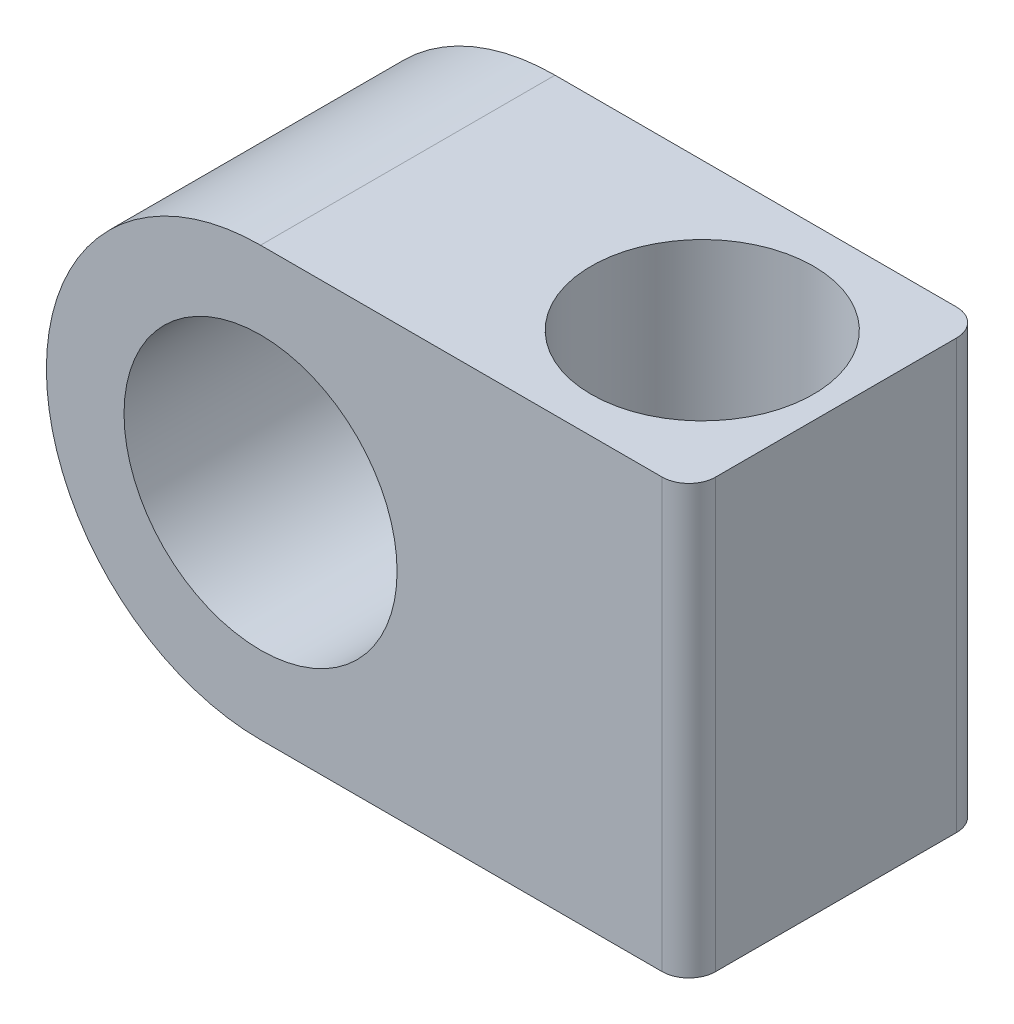
ISO-10303-21;
HEADER;
FILE_DESCRIPTION(('STEP AP214'),'2;1');
FILE_NAME('part.step','',(''),(''),'','','');
FILE_SCHEMA(('AUTOMOTIVE_DESIGN { 1 0 10303 214 1 1 1 1 }'));
ENDSEC;
DATA;
#1=APPLICATION_CONTEXT('core data for automotive mechanical design processes');
#2=APPLICATION_PROTOCOL_DEFINITION('international standard','automotive_design',2000,#1);
#3=PRODUCT_CONTEXT('',#1,'mechanical');
#4=PRODUCT('Part','Part','',(#3));
#5=PRODUCT_RELATED_PRODUCT_CATEGORY('part','',(#4));
#6=PRODUCT_DEFINITION_FORMATION('','',#4);
#7=PRODUCT_DEFINITION_CONTEXT('part definition',#1,'design');
#8=PRODUCT_DEFINITION('design','',#6,#7);
#9=PRODUCT_DEFINITION_SHAPE('','',#8);
#10=(LENGTH_UNIT() NAMED_UNIT(*) SI_UNIT(.MILLI.,.METRE.));
#11=(NAMED_UNIT(*) PLANE_ANGLE_UNIT() SI_UNIT($,.RADIAN.));
#12=(NAMED_UNIT(*) SI_UNIT($,.STERADIAN.) SOLID_ANGLE_UNIT());
#13=UNCERTAINTY_MEASURE_WITH_UNIT(LENGTH_MEASURE(1.E-05),#10,'distance_accuracy_value','');
#14=(GEOMETRIC_REPRESENTATION_CONTEXT(3) GLOBAL_UNCERTAINTY_ASSIGNED_CONTEXT((#13)) GLOBAL_UNIT_ASSIGNED_CONTEXT((#10,
#11,#12)) REPRESENTATION_CONTEXT('',''));
#15=CARTESIAN_POINT('',(0.,0.,0.));
#16=DIRECTION('',(0.,0.,1.));
#17=DIRECTION('',(1.,0.,0.));
#18=AXIS2_PLACEMENT_3D('',#15,#16,#17);
#19=CARTESIAN_POINT('',(15.,0.,10.));
#20=DIRECTION('',(0.,-1.,0.));
#21=DIRECTION('',(0.,0.,-1.));
#22=AXIS2_PLACEMENT_3D('',#19,#20,#21);
#23=CYLINDRICAL_SURFACE('',#22,1.);
#24=DIRECTION('',(0.,-1.,0.));
#25=VECTOR('',#24,1.);
#26=CARTESIAN_POINT('',(16.,0.,10.));
#27=LINE('',#26,#25);
#28=CARTESIAN_POINT('',(16.,8.,10.));
#29=VERTEX_POINT('',#28);
#30=CARTESIAN_POINT('',(16.,-8.,10.));
#31=VERTEX_POINT('',#30);
#32=EDGE_CURVE('E160',#29,#31,#27,.T.);
#33=ORIENTED_EDGE('',*,*,#32,.F.);
#34=CARTESIAN_POINT('',(15.,8.,10.));
#35=DIRECTION('',(0.,-1.,0.));
#36=DIRECTION('',(0.,0.,-1.));
#37=AXIS2_PLACEMENT_3D('',#34,#35,#36);
#38=CIRCLE('',#37,1.);
#39=CARTESIAN_POINT('',(15.,8.,11.));
#40=VERTEX_POINT('',#39);
#41=EDGE_CURVE('E53',#40,#29,#38,.F.);
#42=ORIENTED_EDGE('',*,*,#41,.F.);
#43=DIRECTION('',(0.,-1.,0.));
#44=VECTOR('',#43,1.);
#45=CARTESIAN_POINT('',(15.,0.,11.));
#46=LINE('',#45,#44);
#47=CARTESIAN_POINT('',(15.,-8.,11.));
#48=VERTEX_POINT('',#47);
#49=EDGE_CURVE('E100',#48,#40,#46,.F.);
#50=ORIENTED_EDGE('',*,*,#49,.F.);
#51=CARTESIAN_POINT('',(15.,-8.,10.));
#52=DIRECTION('',(0.,1.,0.));
#53=DIRECTION('',(0.,0.,1.));
#54=AXIS2_PLACEMENT_3D('',#51,#52,#53);
#55=CIRCLE('',#54,1.);
#56=EDGE_CURVE('E11',#31,#48,#55,.F.);
#57=ORIENTED_EDGE('',*,*,#56,.F.);
#58=EDGE_LOOP('',(#33,#42,#50,#57));
#59=FACE_BOUND('',#58,.T.);
#60=ADVANCED_FACE('F45',(#59),#23,.T.);
#61=CARTESIAN_POINT('',(15.,0.,1.));
#62=DIRECTION('',(0.,-1.,0.));
#63=DIRECTION('',(0.,0.,-1.));
#64=AXIS2_PLACEMENT_3D('',#61,#62,#63);
#65=CYLINDRICAL_SURFACE('',#64,1.);
#66=DIRECTION('',(0.,1.,0.));
#67=VECTOR('',#66,1.);
#68=CARTESIAN_POINT('',(16.,0.,1.));
#69=LINE('',#68,#67);
#70=CARTESIAN_POINT('',(16.,-8.,0.999999999999999));
#71=VERTEX_POINT('',#70);
#72=CARTESIAN_POINT('',(16.,8.,1.));
#73=VERTEX_POINT('',#72);
#74=EDGE_CURVE('E117',#71,#73,#69,.T.);
#75=ORIENTED_EDGE('',*,*,#74,.F.);
#76=CARTESIAN_POINT('',(15.,-8.,1.));
#77=DIRECTION('',(0.,1.,0.));
#78=DIRECTION('',(0.,0.,1.));
#79=AXIS2_PLACEMENT_3D('',#76,#77,#78);
#80=CIRCLE('',#79,1.);
#81=CARTESIAN_POINT('',(15.,-8.,0.));
#82=VERTEX_POINT('',#81);
#83=EDGE_CURVE('E153',#82,#71,#80,.F.);
#84=ORIENTED_EDGE('',*,*,#83,.F.);
#85=DIRECTION('',(0.,1.,0.));
#86=VECTOR('',#85,1.);
#87=CARTESIAN_POINT('',(15.,0.,0.));
#88=LINE('',#87,#86);
#89=CARTESIAN_POINT('',(15.,8.,0.));
#90=VERTEX_POINT('',#89);
#91=EDGE_CURVE('E149',#90,#82,#88,.F.);
#92=ORIENTED_EDGE('',*,*,#91,.F.);
#93=CARTESIAN_POINT('',(15.,8.,1.));
#94=DIRECTION('',(0.,-1.,0.));
#95=DIRECTION('',(0.,0.,-1.));
#96=AXIS2_PLACEMENT_3D('',#93,#94,#95);
#97=CIRCLE('',#96,1.);
#98=EDGE_CURVE('E157',#73,#90,#97,.F.);
#99=ORIENTED_EDGE('',*,*,#98,.F.);
#100=EDGE_LOOP('',(#75,#84,#92,#99));
#101=FACE_BOUND('',#100,.T.);
#102=ADVANCED_FACE('F200',(#101),#65,.T.);
#103=CARTESIAN_POINT('',(0.,0.,11.));
#104=DIRECTION('',(0.,0.,-1.));
#105=DIRECTION('',(-1.,0.,0.));
#106=AXIS2_PLACEMENT_3D('',#103,#104,#105);
#107=CYLINDRICAL_SURFACE('',#106,8.);
#108=DIRECTION('',(0.,0.,-1.));
#109=VECTOR('',#108,1.);
#110=CARTESIAN_POINT('',(0.,-8.,11.));
#111=LINE('',#110,#109);
#112=CARTESIAN_POINT('',(0.,-8.,11.));
#113=VERTEX_POINT('',#112);
#114=CARTESIAN_POINT('',(0.,-8.,0.));
#115=VERTEX_POINT('',#114);
#116=EDGE_CURVE('E115',#113,#115,#111,.T.);
#117=ORIENTED_EDGE('',*,*,#116,.F.);
#118=CARTESIAN_POINT('',(0.,0.,11.));
#119=DIRECTION('',(0.,0.,1.));
#120=DIRECTION('',(1.,0.,0.));
#121=AXIS2_PLACEMENT_3D('',#118,#119,#120);
#122=CIRCLE('',#121,8.);
#123=CARTESIAN_POINT('',(0.,8.,11.));
#124=VERTEX_POINT('',#123);
#125=EDGE_CURVE('E99',#124,#113,#122,.T.);
#126=ORIENTED_EDGE('',*,*,#125,.F.);
#127=DIRECTION('',(0.,0.,1.));
#128=VECTOR('',#127,1.);
#129=CARTESIAN_POINT('',(0.,8.,11.));
#130=LINE('',#129,#128);
#131=CARTESIAN_POINT('',(0.,8.,0.));
#132=VERTEX_POINT('',#131);
#133=EDGE_CURVE('E112',#132,#124,#130,.T.);
#134=ORIENTED_EDGE('',*,*,#133,.F.);
#135=CARTESIAN_POINT('',(0.,0.,0.));
#136=DIRECTION('',(0.,0.,1.));
#137=DIRECTION('',(1.,0.,0.));
#138=AXIS2_PLACEMENT_3D('',#135,#136,#137);
#139=CIRCLE('',#138,8.);
#140=EDGE_CURVE('E118',#132,#115,#139,.T.);
#141=ORIENTED_EDGE('',*,*,#140,.T.);
#142=EDGE_LOOP('',(#117,#126,#134,#141));
#143=FACE_BOUND('',#142,.T.);
#144=ADVANCED_FACE('F110',(#143),#107,.T.);
#145=CARTESIAN_POINT('',(0.,0.,11.));
#146=DIRECTION('',(0.,0.,1.));
#147=DIRECTION('',(1.,0.,0.));
#148=AXIS2_PLACEMENT_3D('',#145,#146,#147);
#149=PLANE('',#148);
#150=CARTESIAN_POINT('',(0.,0.,11.));
#151=DIRECTION('',(0.,0.,1.));
#152=DIRECTION('',(1.,0.,0.));
#153=AXIS2_PLACEMENT_3D('',#150,#151,#152);
#154=CIRCLE('',#153,5.1);
#155=CARTESIAN_POINT('',(5.1,0.,11.));
#156=VERTEX_POINT('',#155);
#157=EDGE_CURVE('E145',#156,#156,#154,.T.);
#158=ORIENTED_EDGE('',*,*,#157,.F.);
#159=EDGE_LOOP('',(#158));
#160=FACE_BOUND('',#159,.T.);
#161=DIRECTION('',(-1.,0.,0.));
#162=VECTOR('',#161,1.);
#163=CARTESIAN_POINT('',(16.,-8.,11.));
#164=LINE('',#163,#162);
#165=EDGE_CURVE('E137',#48,#113,#164,.T.);
#166=ORIENTED_EDGE('',*,*,#165,.F.);
#167=ORIENTED_EDGE('',*,*,#49,.T.);
#168=DIRECTION('',(-1.,0.,0.));
#169=VECTOR('',#168,1.);
#170=CARTESIAN_POINT('',(16.,8.,11.));
#171=LINE('',#170,#169);
#172=EDGE_CURVE('E95',#40,#124,#171,.T.);
#173=ORIENTED_EDGE('',*,*,#172,.T.);
#174=ORIENTED_EDGE('',*,*,#125,.T.);
#175=EDGE_LOOP('',(#166,#167,#173,#174));
#176=FACE_BOUND('',#175,.T.);
#177=ADVANCED_FACE('F98',(#160,#176),#149,.T.);
#178=CARTESIAN_POINT('',(0.,0.,0.));
#179=DIRECTION('',(0.,0.,1.));
#180=DIRECTION('',(1.,0.,0.));
#181=AXIS2_PLACEMENT_3D('',#178,#179,#180);
#182=PLANE('',#181);
#183=CARTESIAN_POINT('',(0.,0.,0.));
#184=DIRECTION('',(0.,0.,1.));
#185=DIRECTION('',(1.,0.,0.));
#186=AXIS2_PLACEMENT_3D('',#183,#184,#185);
#187=CIRCLE('',#186,5.1);
#188=CARTESIAN_POINT('',(5.1,0.,0.));
#189=VERTEX_POINT('',#188);
#190=EDGE_CURVE('E128',#189,#189,#187,.T.);
#191=ORIENTED_EDGE('',*,*,#190,.T.);
#192=EDGE_LOOP('',(#191));
#193=FACE_BOUND('',#192,.T.);
#194=DIRECTION('',(-1.,0.,0.));
#195=VECTOR('',#194,1.);
#196=CARTESIAN_POINT('',(16.,8.,0.));
#197=LINE('',#196,#195);
#198=EDGE_CURVE('E104',#90,#132,#197,.T.);
#199=ORIENTED_EDGE('',*,*,#198,.F.);
#200=ORIENTED_EDGE('',*,*,#91,.T.);
#201=DIRECTION('',(-1.,0.,0.));
#202=VECTOR('',#201,1.);
#203=CARTESIAN_POINT('',(16.,-8.,0.));
#204=LINE('',#203,#202);
#205=EDGE_CURVE('E134',#82,#115,#204,.T.);
#206=ORIENTED_EDGE('',*,*,#205,.T.);
#207=ORIENTED_EDGE('',*,*,#140,.F.);
#208=EDGE_LOOP('',(#199,#200,#206,#207));
#209=FACE_BOUND('',#208,.T.);
#210=ADVANCED_FACE('F196',(#193,#209),#182,.F.);
#211=CARTESIAN_POINT('',(16.,-8.,11.));
#212=DIRECTION('',(0.,1.,0.));
#213=DIRECTION('',(0.,0.,1.));
#214=AXIS2_PLACEMENT_3D('',#211,#212,#213);
#215=PLANE('',#214);
#216=CARTESIAN_POINT('',(11.,-8.,5.5));
#217=DIRECTION('',(0.,1.,0.));
#218=DIRECTION('',(0.,0.,1.));
#219=AXIS2_PLACEMENT_3D('',#216,#217,#218);
#220=CIRCLE('',#219,4.15);
#221=CARTESIAN_POINT('',(11.,-8.,9.65));
#222=VERTEX_POINT('',#221);
#223=EDGE_CURVE('E176',#222,#222,#220,.T.);
#224=ORIENTED_EDGE('',*,*,#223,.T.);
#225=EDGE_LOOP('',(#224));
#226=FACE_BOUND('',#225,.T.);
#227=DIRECTION('',(0.,0.,-1.));
#228=VECTOR('',#227,1.);
#229=CARTESIAN_POINT('',(16.,-8.,11.));
#230=LINE('',#229,#228);
#231=EDGE_CURVE('E123',#31,#71,#230,.T.);
#232=ORIENTED_EDGE('',*,*,#231,.F.);
#233=ORIENTED_EDGE('',*,*,#56,.T.);
#234=ORIENTED_EDGE('',*,*,#165,.T.);
#235=ORIENTED_EDGE('',*,*,#116,.T.);
#236=ORIENTED_EDGE('',*,*,#205,.F.);
#237=ORIENTED_EDGE('',*,*,#83,.T.);
#238=EDGE_LOOP('',(#232,#233,#234,#235,#236,#237));
#239=FACE_BOUND('',#238,.T.);
#240=ADVANCED_FACE('F188',(#226,#239),#215,.F.);
#241=CARTESIAN_POINT('',(16.,8.,11.));
#242=DIRECTION('',(0.,-1.,0.));
#243=DIRECTION('',(0.,0.,-1.));
#244=AXIS2_PLACEMENT_3D('',#241,#242,#243);
#245=PLANE('',#244);
#246=CARTESIAN_POINT('',(11.,8.,5.5));
#247=DIRECTION('',(0.,1.,0.));
#248=DIRECTION('',(0.,0.,1.));
#249=AXIS2_PLACEMENT_3D('',#246,#247,#248);
#250=CIRCLE('',#249,4.15);
#251=CARTESIAN_POINT('',(11.,8.,9.65));
#252=VERTEX_POINT('',#251);
#253=EDGE_CURVE('E180',#252,#252,#250,.T.);
#254=ORIENTED_EDGE('',*,*,#253,.F.);
#255=EDGE_LOOP('',(#254));
#256=FACE_BOUND('',#255,.T.);
#257=ORIENTED_EDGE('',*,*,#172,.F.);
#258=ORIENTED_EDGE('',*,*,#41,.T.);
#259=DIRECTION('',(0.,0.,1.));
#260=VECTOR('',#259,1.);
#261=CARTESIAN_POINT('',(16.,8.,11.));
#262=LINE('',#261,#260);
#263=EDGE_CURVE('E105',#73,#29,#262,.T.);
#264=ORIENTED_EDGE('',*,*,#263,.F.);
#265=ORIENTED_EDGE('',*,*,#98,.T.);
#266=ORIENTED_EDGE('',*,*,#198,.T.);
#267=ORIENTED_EDGE('',*,*,#133,.T.);
#268=EDGE_LOOP('',(#257,#258,#264,#265,#266,#267));
#269=FACE_BOUND('',#268,.T.);
#270=ADVANCED_FACE('F120',(#256,#269),#245,.F.);
#271=CARTESIAN_POINT('',(16.,0.,0.));
#272=DIRECTION('',(1.,0.,0.));
#273=DIRECTION('',(0.,0.,-1.));
#274=AXIS2_PLACEMENT_3D('',#271,#272,#273);
#275=PLANE('',#274);
#276=ORIENTED_EDGE('',*,*,#263,.T.);
#277=ORIENTED_EDGE('',*,*,#32,.T.);
#278=ORIENTED_EDGE('',*,*,#231,.T.);
#279=ORIENTED_EDGE('',*,*,#74,.T.);
#280=EDGE_LOOP('',(#276,#277,#278,#279));
#281=FACE_BOUND('',#280,.T.);
#282=ADVANCED_FACE('F169',(#281),#275,.T.);
#283=CARTESIAN_POINT('',(0.,0.,-9.));
#284=DIRECTION('',(0.,0.,1.));
#285=DIRECTION('',(1.,0.,0.));
#286=AXIS2_PLACEMENT_3D('',#283,#284,#285);
#287=CYLINDRICAL_SURFACE('',#286,5.1);
#288=ORIENTED_EDGE('',*,*,#157,.T.);
#289=EDGE_LOOP('',(#288));
#290=FACE_BOUND('',#289,.T.);
#291=ORIENTED_EDGE('',*,*,#190,.F.);
#292=EDGE_LOOP('',(#291));
#293=FACE_BOUND('',#292,.T.);
#294=ADVANCED_FACE('F194',(#290,#293),#287,.F.);
#295=CARTESIAN_POINT('',(11.,-8.,5.5));
#296=DIRECTION('',(0.,1.,0.));
#297=DIRECTION('',(0.,0.,1.));
#298=AXIS2_PLACEMENT_3D('',#295,#296,#297);
#299=CYLINDRICAL_SURFACE('',#298,4.15);
#300=ORIENTED_EDGE('',*,*,#223,.F.);
#301=EDGE_LOOP('',(#300));
#302=FACE_BOUND('',#301,.T.);
#303=ORIENTED_EDGE('',*,*,#253,.T.);
#304=EDGE_LOOP('',(#303));
#305=FACE_BOUND('',#304,.T.);
#306=ADVANCED_FACE('F185',(#302,#305),#299,.F.);
#307=CLOSED_SHELL('',(#60,#102,#144,#177,#210,#240,#270,#282,#294,#306));
#308=MANIFOLD_SOLID_BREP('B2',#307);
#309=ADVANCED_BREP_SHAPE_REPRESENTATION('',(#18,#308),#14);
#310=SHAPE_DEFINITION_REPRESENTATION(#9,#309);
ENDSEC;
END-ISO-10303-21;
